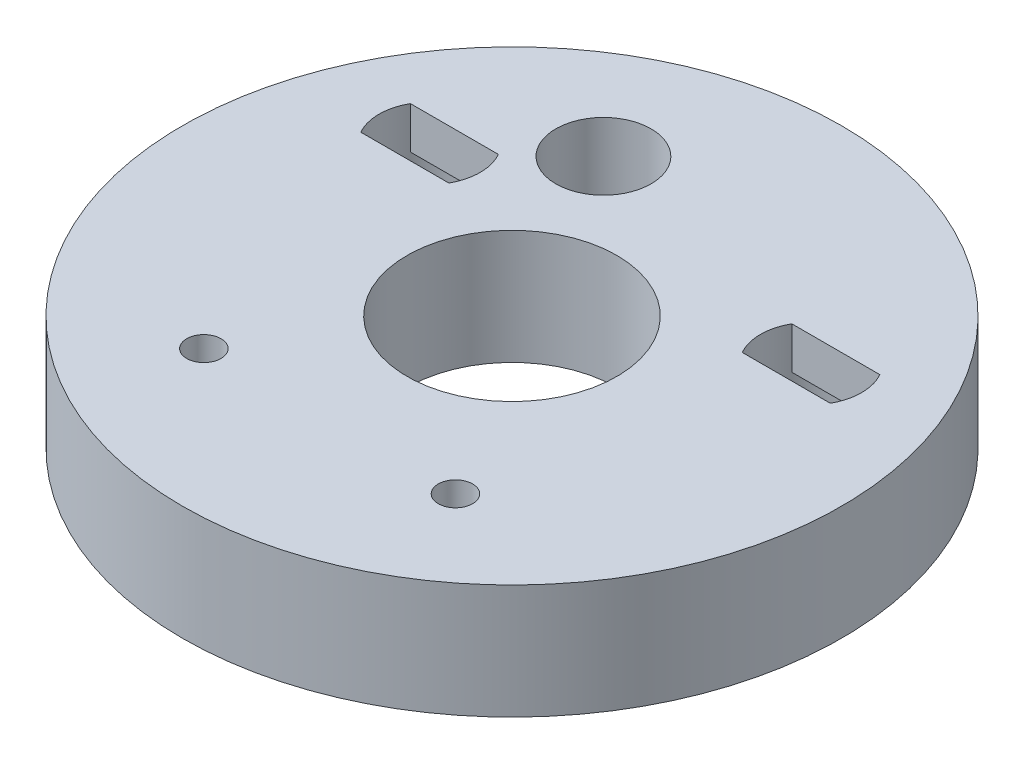
ISO-10303-21;
HEADER;
FILE_DESCRIPTION(('STEP AP214'),'2;1');
FILE_NAME('part.step','',(''),(''),'','','');
FILE_SCHEMA(('AUTOMOTIVE_DESIGN { 1 0 10303 214 1 1 1 1 }'));
ENDSEC;
DATA;
#1=APPLICATION_CONTEXT('core data for automotive mechanical design processes');
#2=APPLICATION_PROTOCOL_DEFINITION('international standard','automotive_design',2000,#1);
#3=PRODUCT_CONTEXT('',#1,'mechanical');
#4=PRODUCT('Part','Part','',(#3));
#5=PRODUCT_RELATED_PRODUCT_CATEGORY('part','',(#4));
#6=PRODUCT_DEFINITION_FORMATION('','',#4);
#7=PRODUCT_DEFINITION_CONTEXT('part definition',#1,'design');
#8=PRODUCT_DEFINITION('design','',#6,#7);
#9=PRODUCT_DEFINITION_SHAPE('','',#8);
#10=(LENGTH_UNIT() NAMED_UNIT(*) SI_UNIT(.MILLI.,.METRE.));
#11=(NAMED_UNIT(*) PLANE_ANGLE_UNIT() SI_UNIT($,.RADIAN.));
#12=(NAMED_UNIT(*) SI_UNIT($,.STERADIAN.) SOLID_ANGLE_UNIT());
#13=UNCERTAINTY_MEASURE_WITH_UNIT(LENGTH_MEASURE(1.E-05),#10,'distance_accuracy_value','');
#14=(GEOMETRIC_REPRESENTATION_CONTEXT(3) GLOBAL_UNCERTAINTY_ASSIGNED_CONTEXT((#13)) GLOBAL_UNIT_ASSIGNED_CONTEXT((#10,
#11,#12)) REPRESENTATION_CONTEXT('',''));
#15=CARTESIAN_POINT('',(0.,0.,0.));
#16=DIRECTION('',(0.,0.,1.));
#17=DIRECTION('',(1.,0.,0.));
#18=AXIS2_PLACEMENT_3D('',#15,#16,#17);
#19=CARTESIAN_POINT('',(0.,0.,0.));
#20=DIRECTION('',(0.,1.,0.));
#21=DIRECTION('',(0.,0.,1.));
#22=AXIS2_PLACEMENT_3D('',#19,#20,#21);
#23=PLANE('',#22);
#24=CARTESIAN_POINT('',(-4.85,0.,-9.64469956572096));
#25=DIRECTION('',(0.,1.,0.));
#26=DIRECTION('',(0.,0.,1.));
#27=AXIS2_PLACEMENT_3D('',#24,#25,#26);
#28=CIRCLE('',#27,2.5);
#29=CARTESIAN_POINT('',(-4.85,0.,-7.14469956572096));
#30=VERTEX_POINT('',#29);
#31=EDGE_CURVE('E201',#30,#30,#28,.T.);
#32=ORIENTED_EDGE('',*,*,#31,.T.);
#33=EDGE_LOOP('',(#32));
#34=FACE_BOUND('',#33,.T.);
#35=CARTESIAN_POINT('',(0.,0.,0.));
#36=DIRECTION('',(0.,1.,0.));
#37=DIRECTION('',(0.,0.,1.));
#38=AXIS2_PLACEMENT_3D('',#35,#36,#37);
#39=CIRCLE('',#38,17.28);
#40=CARTESIAN_POINT('',(0.,0.,-17.28));
#41=VERTEX_POINT('',#40);
#42=EDGE_CURVE('E11',#41,#41,#39,.T.);
#43=ORIENTED_EDGE('',*,*,#42,.F.);
#44=EDGE_LOOP('',(#43));
#45=FACE_BOUND('',#44,.T.);
#46=CARTESIAN_POINT('',(0.,0.,0.));
#47=DIRECTION('',(0.,1.,0.));
#48=DIRECTION('',(0.,0.,1.));
#49=AXIS2_PLACEMENT_3D('',#46,#47,#48);
#50=CIRCLE('',#49,5.5);
#51=CARTESIAN_POINT('',(0.,0.,-5.5));
#52=VERTEX_POINT('',#51);
#53=EDGE_CURVE('E47',#52,#52,#50,.T.);
#54=ORIENTED_EDGE('',*,*,#53,.T.);
#55=EDGE_LOOP('',(#54));
#56=FACE_BOUND('',#55,.T.);
#57=CARTESIAN_POINT('',(-6.595,0.,9.56109165419973));
#58=DIRECTION('',(0.,1.,0.));
#59=DIRECTION('',(0.,0.,1.));
#60=AXIS2_PLACEMENT_3D('',#57,#58,#59);
#61=CIRCLE('',#60,1.9);
#62=CARTESIAN_POINT('',(-6.595,0.,7.66109165419973));
#63=VERTEX_POINT('',#62);
#64=EDGE_CURVE('E230',#63,#63,#61,.T.);
#65=ORIENTED_EDGE('',*,*,#64,.T.);
#66=EDGE_LOOP('',(#65));
#67=FACE_BOUND('',#66,.T.);
#68=CARTESIAN_POINT('',(6.595,0.,9.56109165419973));
#69=DIRECTION('',(0.,1.,0.));
#70=DIRECTION('',(0.,0.,-1.));
#71=AXIS2_PLACEMENT_3D('',#68,#69,#70);
#72=CIRCLE('',#71,1.9);
#73=CARTESIAN_POINT('',(6.595,0.,7.66109165419973));
#74=VERTEX_POINT('',#73);
#75=EDGE_CURVE('E226',#74,#74,#72,.T.);
#76=ORIENTED_EDGE('',*,*,#75,.T.);
#77=EDGE_LOOP('',(#76));
#78=FACE_BOUND('',#77,.T.);
#79=CARTESIAN_POINT('',(10.,0.,-5.67890834580027));
#80=DIRECTION('',(0.,1.,0.));
#81=DIRECTION('',(0.,0.,-1.));
#82=AXIS2_PLACEMENT_3D('',#79,#80,#81);
#83=CIRCLE('',#82,2.65);
#84=CARTESIAN_POINT('',(10.,0.,-8.32890834580027));
#85=VERTEX_POINT('',#84);
#86=EDGE_CURVE('E219',#85,#85,#83,.T.);
#87=ORIENTED_EDGE('',*,*,#86,.T.);
#88=EDGE_LOOP('',(#87));
#89=FACE_BOUND('',#88,.T.);
#90=CARTESIAN_POINT('',(-10.,0.,-5.67890834580027));
#91=DIRECTION('',(0.,1.,0.));
#92=DIRECTION('',(0.,0.,1.));
#93=AXIS2_PLACEMENT_3D('',#90,#91,#92);
#94=CIRCLE('',#93,2.65);
#95=CARTESIAN_POINT('',(-10.,0.,-3.02890834580027));
#96=VERTEX_POINT('',#95);
#97=EDGE_CURVE('E205',#96,#96,#94,.T.);
#98=ORIENTED_EDGE('',*,*,#97,.T.);
#99=EDGE_LOOP('',(#98));
#100=FACE_BOUND('',#99,.T.);
#101=ADVANCED_FACE('F38',(#34,#45,#56,#67,#78,#89,#100),#23,.F.);
#102=CARTESIAN_POINT('',(0.,3.8,0.));
#103=DIRECTION('',(0.,-1.,0.));
#104=DIRECTION('',(0.,0.,-1.));
#105=AXIS2_PLACEMENT_3D('',#102,#103,#104);
#106=CYLINDRICAL_SURFACE('',#105,17.28);
#107=CARTESIAN_POINT('',(0.,6.,0.));
#108=DIRECTION('',(0.,1.,0.));
#109=DIRECTION('',(0.,0.,1.));
#110=AXIS2_PLACEMENT_3D('',#107,#108,#109);
#111=CIRCLE('',#110,17.28);
#112=CARTESIAN_POINT('',(0.,6.,-17.28));
#113=VERTEX_POINT('',#112);
#114=EDGE_CURVE('E196',#113,#113,#111,.T.);
#115=CARTESIAN_POINT('',(0.,0.,-17.28));
#116=CARTESIAN_POINT('',(0.,0.0625000000000001,-17.28));
#117=CARTESIAN_POINT('',(0.,0.125,-17.28));
#118=CARTESIAN_POINT('',(0.,0.25,-17.28));
#119=CARTESIAN_POINT('',(0.,0.3125,-17.28));
#120=CARTESIAN_POINT('',(0.,0.4375,-17.28));
#121=CARTESIAN_POINT('',(0.,0.5,-17.28));
#122=CARTESIAN_POINT('',(0.,0.625,-17.28));
#123=CARTESIAN_POINT('',(0.,0.6875,-17.28));
#124=CARTESIAN_POINT('',(0.,0.8125,-17.28));
#125=CARTESIAN_POINT('',(0.,0.875,-17.28));
#126=CARTESIAN_POINT('',(0.,1.,-17.28));
#127=CARTESIAN_POINT('',(0.,1.0625,-17.28));
#128=CARTESIAN_POINT('',(0.,1.1875,-17.28));
#129=CARTESIAN_POINT('',(0.,1.25,-17.28));
#130=CARTESIAN_POINT('',(0.,1.375,-17.28));
#131=CARTESIAN_POINT('',(0.,1.4375,-17.28));
#132=CARTESIAN_POINT('',(0.,1.5625,-17.28));
#133=CARTESIAN_POINT('',(0.,1.625,-17.28));
#134=CARTESIAN_POINT('',(0.,1.75,-17.28));
#135=CARTESIAN_POINT('',(0.,1.8125,-17.28));
#136=CARTESIAN_POINT('',(0.,1.9375,-17.28));
#137=CARTESIAN_POINT('',(0.,2.,-17.28));
#138=CARTESIAN_POINT('',(0.,2.125,-17.28));
#139=CARTESIAN_POINT('',(0.,2.1875,-17.28));
#140=CARTESIAN_POINT('',(0.,2.3125,-17.28));
#141=CARTESIAN_POINT('',(0.,2.375,-17.28));
#142=CARTESIAN_POINT('',(0.,2.5,-17.28));
#143=CARTESIAN_POINT('',(0.,2.5625,-17.28));
#144=CARTESIAN_POINT('',(0.,2.6875,-17.28));
#145=CARTESIAN_POINT('',(0.,2.75,-17.28));
#146=CARTESIAN_POINT('',(0.,2.875,-17.28));
#147=CARTESIAN_POINT('',(0.,2.9375,-17.28));
#148=CARTESIAN_POINT('',(0.,3.0625,-17.28));
#149=CARTESIAN_POINT('',(0.,3.125,-17.28));
#150=CARTESIAN_POINT('',(0.,3.25,-17.28));
#151=CARTESIAN_POINT('',(0.,3.3125,-17.28));
#152=CARTESIAN_POINT('',(0.,3.4375,-17.28));
#153=CARTESIAN_POINT('',(0.,3.5,-17.28));
#154=CARTESIAN_POINT('',(0.,3.625,-17.28));
#155=CARTESIAN_POINT('',(0.,3.6875,-17.28));
#156=CARTESIAN_POINT('',(0.,3.8125,-17.28));
#157=CARTESIAN_POINT('',(0.,3.875,-17.28));
#158=CARTESIAN_POINT('',(0.,4.,-17.28));
#159=CARTESIAN_POINT('',(0.,4.0625,-17.28));
#160=CARTESIAN_POINT('',(0.,4.1875,-17.28));
#161=CARTESIAN_POINT('',(0.,4.25,-17.28));
#162=CARTESIAN_POINT('',(0.,4.375,-17.28));
#163=CARTESIAN_POINT('',(0.,4.4375,-17.28));
#164=CARTESIAN_POINT('',(0.,4.5625,-17.28));
#165=CARTESIAN_POINT('',(0.,4.625,-17.28));
#166=CARTESIAN_POINT('',(0.,4.75,-17.28));
#167=CARTESIAN_POINT('',(0.,4.8125,-17.28));
#168=CARTESIAN_POINT('',(0.,4.9375,-17.28));
#169=CARTESIAN_POINT('',(0.,5.,-17.28));
#170=CARTESIAN_POINT('',(0.,5.125,-17.28));
#171=CARTESIAN_POINT('',(0.,5.1875,-17.28));
#172=CARTESIAN_POINT('',(0.,5.3125,-17.28));
#173=CARTESIAN_POINT('',(0.,5.375,-17.28));
#174=CARTESIAN_POINT('',(0.,5.5,-17.28));
#175=CARTESIAN_POINT('',(0.,5.5625,-17.28));
#176=CARTESIAN_POINT('',(0.,5.6875,-17.28));
#177=CARTESIAN_POINT('',(0.,5.75,-17.28));
#178=CARTESIAN_POINT('',(0.,5.875,-17.28));
#179=CARTESIAN_POINT('',(0.,5.9375,-17.28));
#180=CARTESIAN_POINT('',(0.,6.,-17.28));
#181=B_SPLINE_CURVE_WITH_KNOTS('',3,(#115,#116,#117,#118,#119,#120,#121,#122,#123,#124,#125,
#126,#127,#128,#129,#130,#131,#132,#133,#134,#135,#136,#137,#138,#139,#140,#141,#142,#143,#144,
#145,#146,#147,#148,#149,#150,#151,#152,#153,#154,#155,#156,#157,#158,#159,#160,#161,#162,#163,
#164,#165,#166,#167,#168,#169,#170,#171,#172,#173,#174,#175,#176,#177,#178,#179,#180),
.UNSPECIFIED.,.F.,.F.,(4,2,2,2,2,2,2,2,2,2,2,2,2,2,2,2,2,2,2,2,2,2,2,2,2,2,2,2,2,2,2,2,4),(0.,
0.1875,0.375,0.5625,0.75,0.9375,1.125,1.3125,1.5,1.6875,1.875,2.0625,2.25,2.4375,2.625,2.8125,
3.,3.1875,3.375,3.5625,3.75,3.9375,4.125,4.3125,4.5,4.6875,4.875,5.0625,5.25,5.4375,5.625,
5.8125,6.),.UNSPECIFIED.);
#182=EDGE_CURVE('BSEAM40',#41,#113,#181,.T.);
#183=ORIENTED_EDGE('',*,*,#42,.T.);
#184=ORIENTED_EDGE('',*,*,#114,.F.);
#185=ORIENTED_EDGE('',*,*,#182,.T.);
#186=ORIENTED_EDGE('',*,*,#182,.F.);
#187=EDGE_LOOP('',(#183,#185,#184,#186));
#188=FACE_BOUND('',#187,.T.);
#189=ADVANCED_FACE('F40',(#188),#106,.T.);
#190=CARTESIAN_POINT('',(0.,3.8,0.));
#191=DIRECTION('',(0.,-1.,0.));
#192=DIRECTION('',(0.,0.,-1.));
#193=AXIS2_PLACEMENT_3D('',#190,#191,#192);
#194=CYLINDRICAL_SURFACE('',#193,5.5);
#195=CARTESIAN_POINT('',(0.,6.,0.));
#196=DIRECTION('',(0.,1.,0.));
#197=DIRECTION('',(0.,0.,1.));
#198=AXIS2_PLACEMENT_3D('',#195,#196,#197);
#199=CIRCLE('',#198,5.5);
#200=CARTESIAN_POINT('',(0.,6.,-5.5));
#201=VERTEX_POINT('',#200);
#202=EDGE_CURVE('E159',#201,#201,#199,.T.);
#203=CARTESIAN_POINT('',(0.,0.,-5.5));
#204=CARTESIAN_POINT('',(0.,0.0625000000000001,-5.5));
#205=CARTESIAN_POINT('',(0.,0.125,-5.5));
#206=CARTESIAN_POINT('',(0.,0.25,-5.5));
#207=CARTESIAN_POINT('',(0.,0.3125,-5.5));
#208=CARTESIAN_POINT('',(0.,0.4375,-5.5));
#209=CARTESIAN_POINT('',(0.,0.5,-5.5));
#210=CARTESIAN_POINT('',(0.,0.625,-5.5));
#211=CARTESIAN_POINT('',(0.,0.6875,-5.5));
#212=CARTESIAN_POINT('',(0.,0.8125,-5.5));
#213=CARTESIAN_POINT('',(0.,0.875,-5.5));
#214=CARTESIAN_POINT('',(0.,1.,-5.5));
#215=CARTESIAN_POINT('',(0.,1.0625,-5.5));
#216=CARTESIAN_POINT('',(0.,1.1875,-5.5));
#217=CARTESIAN_POINT('',(0.,1.25,-5.5));
#218=CARTESIAN_POINT('',(0.,1.375,-5.5));
#219=CARTESIAN_POINT('',(0.,1.4375,-5.5));
#220=CARTESIAN_POINT('',(0.,1.5625,-5.5));
#221=CARTESIAN_POINT('',(0.,1.625,-5.5));
#222=CARTESIAN_POINT('',(0.,1.75,-5.5));
#223=CARTESIAN_POINT('',(0.,1.8125,-5.5));
#224=CARTESIAN_POINT('',(0.,1.9375,-5.5));
#225=CARTESIAN_POINT('',(0.,2.,-5.5));
#226=CARTESIAN_POINT('',(0.,2.125,-5.5));
#227=CARTESIAN_POINT('',(0.,2.1875,-5.5));
#228=CARTESIAN_POINT('',(0.,2.3125,-5.5));
#229=CARTESIAN_POINT('',(0.,2.375,-5.5));
#230=CARTESIAN_POINT('',(0.,2.5,-5.5));
#231=CARTESIAN_POINT('',(0.,2.5625,-5.5));
#232=CARTESIAN_POINT('',(0.,2.6875,-5.5));
#233=CARTESIAN_POINT('',(0.,2.75,-5.5));
#234=CARTESIAN_POINT('',(0.,2.875,-5.5));
#235=CARTESIAN_POINT('',(0.,2.9375,-5.5));
#236=CARTESIAN_POINT('',(0.,3.0625,-5.5));
#237=CARTESIAN_POINT('',(0.,3.125,-5.5));
#238=CARTESIAN_POINT('',(0.,3.25,-5.5));
#239=CARTESIAN_POINT('',(0.,3.3125,-5.5));
#240=CARTESIAN_POINT('',(0.,3.4375,-5.5));
#241=CARTESIAN_POINT('',(0.,3.5,-5.5));
#242=CARTESIAN_POINT('',(0.,3.625,-5.5));
#243=CARTESIAN_POINT('',(0.,3.6875,-5.5));
#244=CARTESIAN_POINT('',(0.,3.8125,-5.5));
#245=CARTESIAN_POINT('',(0.,3.875,-5.5));
#246=CARTESIAN_POINT('',(0.,4.,-5.5));
#247=CARTESIAN_POINT('',(0.,4.0625,-5.5));
#248=CARTESIAN_POINT('',(0.,4.1875,-5.5));
#249=CARTESIAN_POINT('',(0.,4.25,-5.5));
#250=CARTESIAN_POINT('',(0.,4.375,-5.5));
#251=CARTESIAN_POINT('',(0.,4.4375,-5.5));
#252=CARTESIAN_POINT('',(0.,4.5625,-5.5));
#253=CARTESIAN_POINT('',(0.,4.625,-5.5));
#254=CARTESIAN_POINT('',(0.,4.75,-5.5));
#255=CARTESIAN_POINT('',(0.,4.8125,-5.5));
#256=CARTESIAN_POINT('',(0.,4.9375,-5.5));
#257=CARTESIAN_POINT('',(0.,5.,-5.5));
#258=CARTESIAN_POINT('',(0.,5.125,-5.5));
#259=CARTESIAN_POINT('',(0.,5.1875,-5.5));
#260=CARTESIAN_POINT('',(0.,5.3125,-5.5));
#261=CARTESIAN_POINT('',(0.,5.375,-5.5));
#262=CARTESIAN_POINT('',(0.,5.5,-5.5));
#263=CARTESIAN_POINT('',(0.,5.5625,-5.5));
#264=CARTESIAN_POINT('',(0.,5.6875,-5.5));
#265=CARTESIAN_POINT('',(0.,5.75,-5.5));
#266=CARTESIAN_POINT('',(0.,5.875,-5.5));
#267=CARTESIAN_POINT('',(0.,5.9375,-5.5));
#268=CARTESIAN_POINT('',(0.,6.,-5.5));
#269=B_SPLINE_CURVE_WITH_KNOTS('',3,(#203,#204,#205,#206,#207,#208,#209,#210,#211,#212,#213,
#214,#215,#216,#217,#218,#219,#220,#221,#222,#223,#224,#225,#226,#227,#228,#229,#230,#231,#232,
#233,#234,#235,#236,#237,#238,#239,#240,#241,#242,#243,#244,#245,#246,#247,#248,#249,#250,#251,
#252,#253,#254,#255,#256,#257,#258,#259,#260,#261,#262,#263,#264,#265,#266,#267,#268),
.UNSPECIFIED.,.F.,.F.,(4,2,2,2,2,2,2,2,2,2,2,2,2,2,2,2,2,2,2,2,2,2,2,2,2,2,2,2,2,2,2,2,4),(0.,
0.1875,0.375,0.5625,0.75,0.9375,1.125,1.3125,1.5,1.6875,1.875,2.0625,2.25,2.4375,2.625,2.8125,
3.,3.1875,3.375,3.5625,3.75,3.9375,4.125,4.3125,4.5,4.6875,4.875,5.0625,5.25,5.4375,5.625,
5.8125,6.),.UNSPECIFIED.);
#270=EDGE_CURVE('BSEAM243',#52,#201,#269,.T.);
#271=ORIENTED_EDGE('',*,*,#53,.F.);
#272=ORIENTED_EDGE('',*,*,#202,.T.);
#273=ORIENTED_EDGE('',*,*,#270,.T.);
#274=ORIENTED_EDGE('',*,*,#270,.F.);
#275=EDGE_LOOP('',(#271,#273,#272,#274));
#276=FACE_BOUND('',#275,.T.);
#277=ADVANCED_FACE('F243',(#276),#194,.F.);
#278=CARTESIAN_POINT('',(-6.595,3.8,9.56109165419973));
#279=DIRECTION('',(0.,-1.,0.));
#280=DIRECTION('',(0.,0.,-1.));
#281=AXIS2_PLACEMENT_3D('',#278,#279,#280);
#282=CYLINDRICAL_SURFACE('',#281,1.9);
#283=CARTESIAN_POINT('',(-6.595,3.8,9.56109165419973));
#284=DIRECTION('',(0.,1.,0.));
#285=DIRECTION('',(0.,0.,1.));
#286=AXIS2_PLACEMENT_3D('',#283,#284,#285);
#287=CIRCLE('',#286,1.9);
#288=CARTESIAN_POINT('',(-6.595,3.8,7.66109165419973));
#289=VERTEX_POINT('',#288);
#290=EDGE_CURVE('E206',#289,#289,#287,.T.);
#291=CARTESIAN_POINT('',(-6.595,3.8,7.66109165419973));
#292=CARTESIAN_POINT('',(-6.595,3.76041666666667,7.66109165419973));
#293=CARTESIAN_POINT('',(-6.595,3.72083333333333,7.66109165419973));
#294=CARTESIAN_POINT('',(-6.595,3.64166666666667,7.66109165419973));
#295=CARTESIAN_POINT('',(-6.595,3.60208333333333,7.66109165419973));
#296=CARTESIAN_POINT('',(-6.595,3.52291666666667,7.66109165419973));
#297=CARTESIAN_POINT('',(-6.595,3.48333333333333,7.66109165419973));
#298=CARTESIAN_POINT('',(-6.595,3.40416666666667,7.66109165419973));
#299=CARTESIAN_POINT('',(-6.595,3.36458333333333,7.66109165419973));
#300=CARTESIAN_POINT('',(-6.595,3.28541666666667,7.66109165419973));
#301=CARTESIAN_POINT('',(-6.595,3.24583333333333,7.66109165419973));
#302=CARTESIAN_POINT('',(-6.595,3.16666666666667,7.66109165419973));
#303=CARTESIAN_POINT('',(-6.595,3.12708333333333,7.66109165419973));
#304=CARTESIAN_POINT('',(-6.595,3.04791666666667,7.66109165419973));
#305=CARTESIAN_POINT('',(-6.595,3.00833333333333,7.66109165419973));
#306=CARTESIAN_POINT('',(-6.595,2.92916666666667,7.66109165419973));
#307=CARTESIAN_POINT('',(-6.595,2.88958333333333,7.66109165419973));
#308=CARTESIAN_POINT('',(-6.595,2.81041666666667,7.66109165419973));
#309=CARTESIAN_POINT('',(-6.595,2.77083333333333,7.66109165419973));
#310=CARTESIAN_POINT('',(-6.595,2.69166666666667,7.66109165419973));
#311=CARTESIAN_POINT('',(-6.595,2.65208333333333,7.66109165419973));
#312=CARTESIAN_POINT('',(-6.595,2.57291666666667,7.66109165419973));
#313=CARTESIAN_POINT('',(-6.595,2.53333333333333,7.66109165419973));
#314=CARTESIAN_POINT('',(-6.595,2.45416666666667,7.66109165419973));
#315=CARTESIAN_POINT('',(-6.595,2.41458333333333,7.66109165419973));
#316=CARTESIAN_POINT('',(-6.595,2.33541666666667,7.66109165419973));
#317=CARTESIAN_POINT('',(-6.595,2.29583333333333,7.66109165419973));
#318=CARTESIAN_POINT('',(-6.595,2.21666666666667,7.66109165419973));
#319=CARTESIAN_POINT('',(-6.595,2.17708333333333,7.66109165419973));
#320=CARTESIAN_POINT('',(-6.595,2.09791666666667,7.66109165419973));
#321=CARTESIAN_POINT('',(-6.595,2.05833333333333,7.66109165419973));
#322=CARTESIAN_POINT('',(-6.595,1.97916666666667,7.66109165419973));
#323=CARTESIAN_POINT('',(-6.595,1.93958333333333,7.66109165419973));
#324=CARTESIAN_POINT('',(-6.595,1.86041666666667,7.66109165419973));
#325=CARTESIAN_POINT('',(-6.595,1.82083333333333,7.66109165419973));
#326=CARTESIAN_POINT('',(-6.595,1.74166666666667,7.66109165419973));
#327=CARTESIAN_POINT('',(-6.595,1.70208333333333,7.66109165419973));
#328=CARTESIAN_POINT('',(-6.595,1.62291666666667,7.66109165419973));
#329=CARTESIAN_POINT('',(-6.595,1.58333333333333,7.66109165419973));
#330=CARTESIAN_POINT('',(-6.595,1.50416666666667,7.66109165419973));
#331=CARTESIAN_POINT('',(-6.595,1.46458333333333,7.66109165419973));
#332=CARTESIAN_POINT('',(-6.595,1.38541666666667,7.66109165419973));
#333=CARTESIAN_POINT('',(-6.595,1.34583333333333,7.66109165419973));
#334=CARTESIAN_POINT('',(-6.595,1.26666666666667,7.66109165419973));
#335=CARTESIAN_POINT('',(-6.595,1.22708333333333,7.66109165419973));
#336=CARTESIAN_POINT('',(-6.595,1.14791666666667,7.66109165419973));
#337=CARTESIAN_POINT('',(-6.595,1.10833333333333,7.66109165419973));
#338=CARTESIAN_POINT('',(-6.595,1.02916666666667,7.66109165419973));
#339=CARTESIAN_POINT('',(-6.595,0.989583333333334,7.66109165419973));
#340=CARTESIAN_POINT('',(-6.595,0.910416666666667,7.66109165419973));
#341=CARTESIAN_POINT('',(-6.595,0.870833333333333,7.66109165419973));
#342=CARTESIAN_POINT('',(-6.595,0.791666666666667,7.66109165419973));
#343=CARTESIAN_POINT('',(-6.595,0.752083333333333,7.66109165419973));
#344=CARTESIAN_POINT('',(-6.595,0.672916666666667,7.66109165419973));
#345=CARTESIAN_POINT('',(-6.595,0.633333333333333,7.66109165419973));
#346=CARTESIAN_POINT('',(-6.595,0.554166666666667,7.66109165419973));
#347=CARTESIAN_POINT('',(-6.595,0.514583333333334,7.66109165419973));
#348=CARTESIAN_POINT('',(-6.595,0.435416666666667,7.66109165419973));
#349=CARTESIAN_POINT('',(-6.595,0.395833333333334,7.66109165419973));
#350=CARTESIAN_POINT('',(-6.595,0.316666666666667,7.66109165419973));
#351=CARTESIAN_POINT('',(-6.595,0.277083333333333,7.66109165419973));
#352=CARTESIAN_POINT('',(-6.595,0.197916666666667,7.66109165419973));
#353=CARTESIAN_POINT('',(-6.595,0.158333333333333,7.66109165419973));
#354=CARTESIAN_POINT('',(-6.595,0.0791666666666666,7.66109165419973));
#355=CARTESIAN_POINT('',(-6.595,0.0395833333333333,7.66109165419973));
#356=CARTESIAN_POINT('',(-6.595,0.,7.66109165419973));
#357=B_SPLINE_CURVE_WITH_KNOTS('',3,(#291,#292,#293,#294,#295,#296,#297,#298,#299,#300,#301,
#302,#303,#304,#305,#306,#307,#308,#309,#310,#311,#312,#313,#314,#315,#316,#317,#318,#319,#320,
#321,#322,#323,#324,#325,#326,#327,#328,#329,#330,#331,#332,#333,#334,#335,#336,#337,#338,#339,
#340,#341,#342,#343,#344,#345,#346,#347,#348,#349,#350,#351,#352,#353,#354,#355,#356),
.UNSPECIFIED.,.F.,.F.,(4,2,2,2,2,2,2,2,2,2,2,2,2,2,2,2,2,2,2,2,2,2,2,2,2,2,2,2,2,2,2,2,4),(0.,
0.11875,0.2375,0.35625,0.475,0.59375,0.7125,0.83125,0.95,1.06875,1.1875,1.30625,1.425,1.54375,
1.6625,1.78125,1.9,2.01875,2.1375,2.25625,2.375,2.49375,2.6125,2.73125,2.85,2.96875,3.0875,
3.20625,3.325,3.44375,3.5625,3.68125,3.8),.UNSPECIFIED.);
#358=EDGE_CURVE('BSEAM246',#289,#63,#357,.T.);
#359=ORIENTED_EDGE('',*,*,#290,.T.);
#360=ORIENTED_EDGE('',*,*,#64,.F.);
#361=ORIENTED_EDGE('',*,*,#358,.T.);
#362=ORIENTED_EDGE('',*,*,#358,.F.);
#363=EDGE_LOOP('',(#359,#361,#360,#362));
#364=FACE_BOUND('',#363,.T.);
#365=ADVANCED_FACE('F246',(#364),#282,.F.);
#366=CARTESIAN_POINT('',(6.595,3.8,9.56109165419973));
#367=DIRECTION('',(0.,-1.,0.));
#368=DIRECTION('',(0.,0.,-1.));
#369=AXIS2_PLACEMENT_3D('',#366,#367,#368);
#370=CYLINDRICAL_SURFACE('',#369,1.9);
#371=CARTESIAN_POINT('',(6.595,3.8,9.56109165419973));
#372=DIRECTION('',(0.,1.,0.));
#373=DIRECTION('',(0.,0.,-1.));
#374=AXIS2_PLACEMENT_3D('',#371,#372,#373);
#375=CIRCLE('',#374,1.9);
#376=CARTESIAN_POINT('',(6.595,3.8,7.66109165419973));
#377=VERTEX_POINT('',#376);
#378=EDGE_CURVE('E200',#377,#377,#375,.T.);
#379=CARTESIAN_POINT('',(6.595,3.8,7.66109165419973));
#380=CARTESIAN_POINT('',(6.595,3.76041666666667,7.66109165419973));
#381=CARTESIAN_POINT('',(6.595,3.72083333333333,7.66109165419973));
#382=CARTESIAN_POINT('',(6.595,3.64166666666667,7.66109165419973));
#383=CARTESIAN_POINT('',(6.595,3.60208333333333,7.66109165419973));
#384=CARTESIAN_POINT('',(6.595,3.52291666666667,7.66109165419973));
#385=CARTESIAN_POINT('',(6.595,3.48333333333333,7.66109165419973));
#386=CARTESIAN_POINT('',(6.595,3.40416666666667,7.66109165419973));
#387=CARTESIAN_POINT('',(6.595,3.36458333333333,7.66109165419973));
#388=CARTESIAN_POINT('',(6.595,3.28541666666667,7.66109165419973));
#389=CARTESIAN_POINT('',(6.595,3.24583333333333,7.66109165419973));
#390=CARTESIAN_POINT('',(6.595,3.16666666666667,7.66109165419973));
#391=CARTESIAN_POINT('',(6.595,3.12708333333333,7.66109165419973));
#392=CARTESIAN_POINT('',(6.595,3.04791666666667,7.66109165419973));
#393=CARTESIAN_POINT('',(6.595,3.00833333333333,7.66109165419973));
#394=CARTESIAN_POINT('',(6.595,2.92916666666667,7.66109165419973));
#395=CARTESIAN_POINT('',(6.595,2.88958333333333,7.66109165419973));
#396=CARTESIAN_POINT('',(6.595,2.81041666666667,7.66109165419973));
#397=CARTESIAN_POINT('',(6.595,2.77083333333333,7.66109165419973));
#398=CARTESIAN_POINT('',(6.595,2.69166666666667,7.66109165419973));
#399=CARTESIAN_POINT('',(6.595,2.65208333333333,7.66109165419973));
#400=CARTESIAN_POINT('',(6.595,2.57291666666667,7.66109165419973));
#401=CARTESIAN_POINT('',(6.595,2.53333333333333,7.66109165419973));
#402=CARTESIAN_POINT('',(6.595,2.45416666666667,7.66109165419973));
#403=CARTESIAN_POINT('',(6.595,2.41458333333333,7.66109165419973));
#404=CARTESIAN_POINT('',(6.595,2.33541666666667,7.66109165419973));
#405=CARTESIAN_POINT('',(6.595,2.29583333333333,7.66109165419973));
#406=CARTESIAN_POINT('',(6.595,2.21666666666667,7.66109165419973));
#407=CARTESIAN_POINT('',(6.595,2.17708333333333,7.66109165419973));
#408=CARTESIAN_POINT('',(6.595,2.09791666666667,7.66109165419973));
#409=CARTESIAN_POINT('',(6.595,2.05833333333333,7.66109165419973));
#410=CARTESIAN_POINT('',(6.595,1.97916666666667,7.66109165419973));
#411=CARTESIAN_POINT('',(6.595,1.93958333333333,7.66109165419973));
#412=CARTESIAN_POINT('',(6.595,1.86041666666667,7.66109165419973));
#413=CARTESIAN_POINT('',(6.595,1.82083333333333,7.66109165419973));
#414=CARTESIAN_POINT('',(6.595,1.74166666666667,7.66109165419973));
#415=CARTESIAN_POINT('',(6.595,1.70208333333333,7.66109165419973));
#416=CARTESIAN_POINT('',(6.595,1.62291666666667,7.66109165419973));
#417=CARTESIAN_POINT('',(6.595,1.58333333333333,7.66109165419973));
#418=CARTESIAN_POINT('',(6.595,1.50416666666667,7.66109165419973));
#419=CARTESIAN_POINT('',(6.595,1.46458333333333,7.66109165419973));
#420=CARTESIAN_POINT('',(6.595,1.38541666666667,7.66109165419973));
#421=CARTESIAN_POINT('',(6.595,1.34583333333333,7.66109165419973));
#422=CARTESIAN_POINT('',(6.595,1.26666666666667,7.66109165419973));
#423=CARTESIAN_POINT('',(6.595,1.22708333333333,7.66109165419973));
#424=CARTESIAN_POINT('',(6.595,1.14791666666667,7.66109165419973));
#425=CARTESIAN_POINT('',(6.595,1.10833333333333,7.66109165419973));
#426=CARTESIAN_POINT('',(6.595,1.02916666666667,7.66109165419973));
#427=CARTESIAN_POINT('',(6.595,0.989583333333334,7.66109165419973));
#428=CARTESIAN_POINT('',(6.595,0.910416666666667,7.66109165419973));
#429=CARTESIAN_POINT('',(6.595,0.870833333333333,7.66109165419973));
#430=CARTESIAN_POINT('',(6.595,0.791666666666667,7.66109165419973));
#431=CARTESIAN_POINT('',(6.595,0.752083333333333,7.66109165419973));
#432=CARTESIAN_POINT('',(6.595,0.672916666666667,7.66109165419973));
#433=CARTESIAN_POINT('',(6.595,0.633333333333333,7.66109165419973));
#434=CARTESIAN_POINT('',(6.595,0.554166666666667,7.66109165419973));
#435=CARTESIAN_POINT('',(6.595,0.514583333333334,7.66109165419973));
#436=CARTESIAN_POINT('',(6.595,0.435416666666667,7.66109165419973));
#437=CARTESIAN_POINT('',(6.595,0.395833333333334,7.66109165419973));
#438=CARTESIAN_POINT('',(6.595,0.316666666666667,7.66109165419973));
#439=CARTESIAN_POINT('',(6.595,0.277083333333333,7.66109165419973));
#440=CARTESIAN_POINT('',(6.595,0.197916666666667,7.66109165419973));
#441=CARTESIAN_POINT('',(6.595,0.158333333333333,7.66109165419973));
#442=CARTESIAN_POINT('',(6.595,0.0791666666666666,7.66109165419973));
#443=CARTESIAN_POINT('',(6.595,0.0395833333333333,7.66109165419973));
#444=CARTESIAN_POINT('',(6.595,0.,7.66109165419973));
#445=B_SPLINE_CURVE_WITH_KNOTS('',3,(#379,#380,#381,#382,#383,#384,#385,#386,#387,#388,#389,
#390,#391,#392,#393,#394,#395,#396,#397,#398,#399,#400,#401,#402,#403,#404,#405,#406,#407,#408,
#409,#410,#411,#412,#413,#414,#415,#416,#417,#418,#419,#420,#421,#422,#423,#424,#425,#426,#427,
#428,#429,#430,#431,#432,#433,#434,#435,#436,#437,#438,#439,#440,#441,#442,#443,#444),
.UNSPECIFIED.,.F.,.F.,(4,2,2,2,2,2,2,2,2,2,2,2,2,2,2,2,2,2,2,2,2,2,2,2,2,2,2,2,2,2,2,2,4),(0.,
0.11875,0.2375,0.35625,0.475,0.59375,0.7125,0.83125,0.95,1.06875,1.1875,1.30625,1.425,1.54375,
1.6625,1.78125,1.9,2.01875,2.1375,2.25625,2.375,2.49375,2.6125,2.73125,2.85,2.96875,3.0875,
3.20625,3.325,3.44375,3.5625,3.68125,3.8),.UNSPECIFIED.);
#446=EDGE_CURVE('BSEAM289',#377,#74,#445,.T.);
#447=ORIENTED_EDGE('',*,*,#378,.T.);
#448=ORIENTED_EDGE('',*,*,#75,.F.);
#449=ORIENTED_EDGE('',*,*,#446,.T.);
#450=ORIENTED_EDGE('',*,*,#446,.F.);
#451=EDGE_LOOP('',(#447,#449,#448,#450));
#452=FACE_BOUND('',#451,.T.);
#453=ADVANCED_FACE('F289',(#452),#370,.F.);
#454=CARTESIAN_POINT('',(10.,3.8,-5.67890834580027));
#455=DIRECTION('',(0.,-1.,0.));
#456=DIRECTION('',(0.,0.,-1.));
#457=AXIS2_PLACEMENT_3D('',#454,#455,#456);
#458=CYLINDRICAL_SURFACE('',#457,2.65);
#459=CARTESIAN_POINT('',(10.,3.8,-5.67890834580027));
#460=DIRECTION('',(0.,1.,0.));
#461=DIRECTION('',(0.,0.,-1.));
#462=AXIS2_PLACEMENT_3D('',#459,#460,#461);
#463=CIRCLE('',#462,2.65);
#464=CARTESIAN_POINT('',(12.3092206477511,3.8,-6.97890834580027));
#465=VERTEX_POINT('',#464);
#466=CARTESIAN_POINT('',(7.6907793522489,3.8,-6.97890834580027));
#467=VERTEX_POINT('',#466);
#468=EDGE_CURVE('E214',#465,#467,#463,.T.);
#469=ORIENTED_EDGE('',*,*,#468,.T.);
#470=DIRECTION('',(0.,-1.,0.));
#471=VECTOR('',#470,1.);
#472=CARTESIAN_POINT('',(7.6907793522489,6.,-6.97890834580027));
#473=LINE('',#472,#471);
#474=CARTESIAN_POINT('',(7.6907793522489,6.,-6.97890834580027));
#475=VERTEX_POINT('',#474);
#476=EDGE_CURVE('E177',#475,#467,#473,.T.);
#477=ORIENTED_EDGE('',*,*,#476,.F.);
#478=CARTESIAN_POINT('',(10.,6.,-5.67890834580027));
#479=DIRECTION('',(0.,1.,0.));
#480=DIRECTION('',(0.,0.,-1.));
#481=AXIS2_PLACEMENT_3D('',#478,#479,#480);
#482=CIRCLE('',#481,2.65);
#483=CARTESIAN_POINT('',(7.6907793522489,6.,-4.37890834580027));
#484=VERTEX_POINT('',#483);
#485=EDGE_CURVE('E164',#475,#484,#482,.T.);
#486=ORIENTED_EDGE('',*,*,#485,.T.);
#487=DIRECTION('',(0.,-1.,0.));
#488=VECTOR('',#487,1.);
#489=CARTESIAN_POINT('',(7.6907793522489,6.,-4.37890834580027));
#490=LINE('',#489,#488);
#491=CARTESIAN_POINT('',(7.6907793522489,3.8,-4.37890834580027));
#492=VERTEX_POINT('',#491);
#493=EDGE_CURVE('E192',#484,#492,#490,.T.);
#494=ORIENTED_EDGE('',*,*,#493,.T.);
#495=CARTESIAN_POINT('',(12.3092206477511,3.8,-4.37890834580027));
#496=VERTEX_POINT('',#495);
#497=EDGE_CURVE('E218',#492,#496,#463,.T.);
#498=ORIENTED_EDGE('',*,*,#497,.T.);
#499=DIRECTION('',(0.,-1.,0.));
#500=VECTOR('',#499,1.);
#501=CARTESIAN_POINT('',(12.3092206477511,6.,-4.37890834580027));
#502=LINE('',#501,#500);
#503=CARTESIAN_POINT('',(12.3092206477511,6.,-4.37890834580027));
#504=VERTEX_POINT('',#503);
#505=EDGE_CURVE('E189',#504,#496,#502,.T.);
#506=ORIENTED_EDGE('',*,*,#505,.F.);
#507=CARTESIAN_POINT('',(10.,6.,-5.67890834580027));
#508=DIRECTION('',(0.,1.,0.));
#509=DIRECTION('',(0.,0.,-1.));
#510=AXIS2_PLACEMENT_3D('',#507,#508,#509);
#511=CIRCLE('',#510,2.65);
#512=CARTESIAN_POINT('',(12.3092206477511,6.,-6.97890834580027));
#513=VERTEX_POINT('',#512);
#514=EDGE_CURVE('E170',#504,#513,#511,.T.);
#515=ORIENTED_EDGE('',*,*,#514,.T.);
#516=DIRECTION('',(0.,-1.,0.));
#517=VECTOR('',#516,1.);
#518=CARTESIAN_POINT('',(12.3092206477511,6.,-6.97890834580027));
#519=LINE('',#518,#517);
#520=EDGE_CURVE('E185',#513,#465,#519,.T.);
#521=ORIENTED_EDGE('',*,*,#520,.T.);
#522=EDGE_LOOP('',(#469,#477,#486,#494,#498,#506,#515,#521));
#523=FACE_BOUND('',#522,.T.);
#524=ORIENTED_EDGE('',*,*,#86,.F.);
#525=EDGE_LOOP('',(#524));
#526=FACE_BOUND('',#525,.T.);
#527=ADVANCED_FACE('F276',(#523,#526),#458,.F.);
#528=CARTESIAN_POINT('',(-10.,3.8,-5.67890834580027));
#529=DIRECTION('',(0.,-1.,0.));
#530=DIRECTION('',(0.,0.,-1.));
#531=AXIS2_PLACEMENT_3D('',#528,#529,#530);
#532=CYLINDRICAL_SURFACE('',#531,2.65);
#533=CARTESIAN_POINT('',(-10.,3.8,-5.67890834580027));
#534=DIRECTION('',(0.,1.,0.));
#535=DIRECTION('',(0.,0.,1.));
#536=AXIS2_PLACEMENT_3D('',#533,#534,#535);
#537=CIRCLE('',#536,2.65);
#538=CARTESIAN_POINT('',(-12.3092206477511,3.8,-4.37890834580027));
#539=VERTEX_POINT('',#538);
#540=CARTESIAN_POINT('',(-7.6907793522489,3.8,-4.37890834580027));
#541=VERTEX_POINT('',#540);
#542=EDGE_CURVE('E207',#539,#541,#537,.T.);
#543=ORIENTED_EDGE('',*,*,#542,.T.);
#544=DIRECTION('',(0.,-1.,0.));
#545=VECTOR('',#544,1.);
#546=CARTESIAN_POINT('',(-7.6907793522489,6.,-4.37890834580027));
#547=LINE('',#546,#545);
#548=CARTESIAN_POINT('',(-7.6907793522489,6.,-4.37890834580027));
#549=VERTEX_POINT('',#548);
#550=EDGE_CURVE('E125',#549,#541,#547,.T.);
#551=ORIENTED_EDGE('',*,*,#550,.F.);
#552=CARTESIAN_POINT('',(-10.,6.,-5.67890834580027));
#553=DIRECTION('',(0.,1.,0.));
#554=DIRECTION('',(0.,0.,1.));
#555=AXIS2_PLACEMENT_3D('',#552,#553,#554);
#556=CIRCLE('',#555,2.65);
#557=CARTESIAN_POINT('',(-7.6907793522489,6.,-6.97890834580027));
#558=VERTEX_POINT('',#557);
#559=EDGE_CURVE('E131',#549,#558,#556,.T.);
#560=ORIENTED_EDGE('',*,*,#559,.T.);
#561=DIRECTION('',(0.,-1.,0.));
#562=VECTOR('',#561,1.);
#563=CARTESIAN_POINT('',(-7.6907793522489,6.,-6.97890834580027));
#564=LINE('',#563,#562);
#565=CARTESIAN_POINT('',(-7.6907793522489,3.8,-6.97890834580027));
#566=VERTEX_POINT('',#565);
#567=EDGE_CURVE('E150',#558,#566,#564,.T.);
#568=ORIENTED_EDGE('',*,*,#567,.T.);
#569=CARTESIAN_POINT('',(-12.3092206477511,3.8,-6.97890834580027));
#570=VERTEX_POINT('',#569);
#571=EDGE_CURVE('E210',#566,#570,#537,.T.);
#572=ORIENTED_EDGE('',*,*,#571,.T.);
#573=DIRECTION('',(0.,-1.,0.));
#574=VECTOR('',#573,1.);
#575=CARTESIAN_POINT('',(-12.3092206477511,6.,-6.97890834580027));
#576=LINE('',#575,#574);
#577=CARTESIAN_POINT('',(-12.3092206477511,6.,-6.97890834580027));
#578=VERTEX_POINT('',#577);
#579=EDGE_CURVE('E112',#578,#570,#576,.T.);
#580=ORIENTED_EDGE('',*,*,#579,.F.);
#581=CARTESIAN_POINT('',(-10.,6.,-5.67890834580027));
#582=DIRECTION('',(0.,1.,0.));
#583=DIRECTION('',(0.,0.,1.));
#584=AXIS2_PLACEMENT_3D('',#581,#582,#583);
#585=CIRCLE('',#584,2.65);
#586=CARTESIAN_POINT('',(-12.3092206477511,6.,-4.37890834580027));
#587=VERTEX_POINT('',#586);
#588=EDGE_CURVE('E105',#578,#587,#585,.T.);
#589=ORIENTED_EDGE('',*,*,#588,.T.);
#590=DIRECTION('',(0.,-1.,0.));
#591=VECTOR('',#590,1.);
#592=CARTESIAN_POINT('',(-12.3092206477511,6.,-4.37890834580027));
#593=LINE('',#592,#591);
#594=EDGE_CURVE('E110',#587,#539,#593,.T.);
#595=ORIENTED_EDGE('',*,*,#594,.T.);
#596=EDGE_LOOP('',(#543,#551,#560,#568,#572,#580,#589,#595));
#597=FACE_BOUND('',#596,.T.);
#598=ORIENTED_EDGE('',*,*,#97,.F.);
#599=EDGE_LOOP('',(#598));
#600=FACE_BOUND('',#599,.T.);
#601=ADVANCED_FACE('F108',(#597,#600),#532,.F.);
#602=CARTESIAN_POINT('',(-4.85,0.,-9.64469956572096));
#603=DIRECTION('',(0.,1.,0.));
#604=DIRECTION('',(0.,0.,1.));
#605=AXIS2_PLACEMENT_3D('',#602,#603,#604);
#606=CYLINDRICAL_SURFACE('',#605,2.5);
#607=CARTESIAN_POINT('',(-4.85,6.,-9.64469956572096));
#608=DIRECTION('',(0.,1.,0.));
#609=DIRECTION('',(0.,0.,1.));
#610=AXIS2_PLACEMENT_3D('',#607,#608,#609);
#611=CIRCLE('',#610,2.5);
#612=CARTESIAN_POINT('',(-4.85,6.,-7.14469956572096));
#613=VERTEX_POINT('',#612);
#614=EDGE_CURVE('E124',#613,#613,#611,.T.);
#615=CARTESIAN_POINT('',(-4.85,0.,-7.14469956572096));
#616=CARTESIAN_POINT('',(-4.85,0.0624999999999999,-7.14469956572096));
#617=CARTESIAN_POINT('',(-4.85,0.125,-7.14469956572096));
#618=CARTESIAN_POINT('',(-4.85,0.25,-7.14469956572096));
#619=CARTESIAN_POINT('',(-4.85,0.3125,-7.14469956572096));
#620=CARTESIAN_POINT('',(-4.85,0.4375,-7.14469956572096));
#621=CARTESIAN_POINT('',(-4.85,0.5,-7.14469956572096));
#622=CARTESIAN_POINT('',(-4.85,0.625,-7.14469956572096));
#623=CARTESIAN_POINT('',(-4.85,0.6875,-7.14469956572096));
#624=CARTESIAN_POINT('',(-4.85,0.8125,-7.14469956572096));
#625=CARTESIAN_POINT('',(-4.85,0.875,-7.14469956572096));
#626=CARTESIAN_POINT('',(-4.85,1.,-7.14469956572096));
#627=CARTESIAN_POINT('',(-4.85,1.0625,-7.14469956572096));
#628=CARTESIAN_POINT('',(-4.85,1.1875,-7.14469956572096));
#629=CARTESIAN_POINT('',(-4.85,1.25,-7.14469956572096));
#630=CARTESIAN_POINT('',(-4.85,1.375,-7.14469956572096));
#631=CARTESIAN_POINT('',(-4.85,1.4375,-7.14469956572096));
#632=CARTESIAN_POINT('',(-4.85,1.5625,-7.14469956572096));
#633=CARTESIAN_POINT('',(-4.85,1.625,-7.14469956572096));
#634=CARTESIAN_POINT('',(-4.85,1.75,-7.14469956572096));
#635=CARTESIAN_POINT('',(-4.85,1.8125,-7.14469956572096));
#636=CARTESIAN_POINT('',(-4.85,1.9375,-7.14469956572096));
#637=CARTESIAN_POINT('',(-4.85,2.,-7.14469956572096));
#638=CARTESIAN_POINT('',(-4.85,2.125,-7.14469956572096));
#639=CARTESIAN_POINT('',(-4.85,2.1875,-7.14469956572096));
#640=CARTESIAN_POINT('',(-4.85,2.3125,-7.14469956572096));
#641=CARTESIAN_POINT('',(-4.85,2.375,-7.14469956572096));
#642=CARTESIAN_POINT('',(-4.85,2.5,-7.14469956572096));
#643=CARTESIAN_POINT('',(-4.85,2.5625,-7.14469956572096));
#644=CARTESIAN_POINT('',(-4.85,2.6875,-7.14469956572096));
#645=CARTESIAN_POINT('',(-4.85,2.75,-7.14469956572096));
#646=CARTESIAN_POINT('',(-4.85,2.875,-7.14469956572096));
#647=CARTESIAN_POINT('',(-4.85,2.9375,-7.14469956572096));
#648=CARTESIAN_POINT('',(-4.85,3.0625,-7.14469956572096));
#649=CARTESIAN_POINT('',(-4.85,3.125,-7.14469956572096));
#650=CARTESIAN_POINT('',(-4.85,3.25,-7.14469956572096));
#651=CARTESIAN_POINT('',(-4.85,3.3125,-7.14469956572096));
#652=CARTESIAN_POINT('',(-4.85,3.4375,-7.14469956572096));
#653=CARTESIAN_POINT('',(-4.85,3.5,-7.14469956572096));
#654=CARTESIAN_POINT('',(-4.85,3.625,-7.14469956572096));
#655=CARTESIAN_POINT('',(-4.85,3.6875,-7.14469956572096));
#656=CARTESIAN_POINT('',(-4.85,3.8125,-7.14469956572096));
#657=CARTESIAN_POINT('',(-4.85,3.875,-7.14469956572096));
#658=CARTESIAN_POINT('',(-4.85,4.,-7.14469956572096));
#659=CARTESIAN_POINT('',(-4.85,4.0625,-7.14469956572096));
#660=CARTESIAN_POINT('',(-4.85,4.1875,-7.14469956572096));
#661=CARTESIAN_POINT('',(-4.85,4.25,-7.14469956572096));
#662=CARTESIAN_POINT('',(-4.85,4.375,-7.14469956572096));
#663=CARTESIAN_POINT('',(-4.85,4.4375,-7.14469956572096));
#664=CARTESIAN_POINT('',(-4.85,4.5625,-7.14469956572096));
#665=CARTESIAN_POINT('',(-4.85,4.625,-7.14469956572096));
#666=CARTESIAN_POINT('',(-4.85,4.75,-7.14469956572096));
#667=CARTESIAN_POINT('',(-4.85,4.8125,-7.14469956572096));
#668=CARTESIAN_POINT('',(-4.85,4.9375,-7.14469956572096));
#669=CARTESIAN_POINT('',(-4.85,5.,-7.14469956572096));
#670=CARTESIAN_POINT('',(-4.85,5.125,-7.14469956572096));
#671=CARTESIAN_POINT('',(-4.85,5.1875,-7.14469956572096));
#672=CARTESIAN_POINT('',(-4.85,5.3125,-7.14469956572096));
#673=CARTESIAN_POINT('',(-4.85,5.375,-7.14469956572096));
#674=CARTESIAN_POINT('',(-4.85,5.5,-7.14469956572096));
#675=CARTESIAN_POINT('',(-4.85,5.5625,-7.14469956572096));
#676=CARTESIAN_POINT('',(-4.85,5.6875,-7.14469956572096));
#677=CARTESIAN_POINT('',(-4.85,5.75,-7.14469956572096));
#678=CARTESIAN_POINT('',(-4.85,5.875,-7.14469956572096));
#679=CARTESIAN_POINT('',(-4.85,5.9375,-7.14469956572096));
#680=CARTESIAN_POINT('',(-4.85,6.,-7.14469956572096));
#681=B_SPLINE_CURVE_WITH_KNOTS('',3,(#615,#616,#617,#618,#619,#620,#621,#622,#623,#624,#625,
#626,#627,#628,#629,#630,#631,#632,#633,#634,#635,#636,#637,#638,#639,#640,#641,#642,#643,#644,
#645,#646,#647,#648,#649,#650,#651,#652,#653,#654,#655,#656,#657,#658,#659,#660,#661,#662,#663,
#664,#665,#666,#667,#668,#669,#670,#671,#672,#673,#674,#675,#676,#677,#678,#679,#680),
.UNSPECIFIED.,.F.,.F.,(4,2,2,2,2,2,2,2,2,2,2,2,2,2,2,2,2,2,2,2,2,2,2,2,2,2,2,2,2,2,2,2,4),(0.,
0.1875,0.375,0.5625,0.75,0.9375,1.125,1.3125,1.5,1.6875,1.875,2.0625,2.25,2.4375,2.625,2.8125,
3.,3.1875,3.375,3.5625,3.75,3.9375,4.125,4.3125,4.5,4.6875,4.875,5.0625,5.25,5.4375,5.625,
5.8125,6.),.UNSPECIFIED.);
#682=EDGE_CURVE('BSEAM264',#30,#613,#681,.T.);
#683=ORIENTED_EDGE('',*,*,#31,.F.);
#684=ORIENTED_EDGE('',*,*,#614,.T.);
#685=ORIENTED_EDGE('',*,*,#682,.T.);
#686=ORIENTED_EDGE('',*,*,#682,.F.);
#687=EDGE_LOOP('',(#683,#685,#684,#686));
#688=FACE_BOUND('',#687,.T.);
#689=ADVANCED_FACE('F264',(#688),#606,.F.);
#690=CARTESIAN_POINT('',(0.,3.8,0.));
#691=DIRECTION('',(0.,1.,0.));
#692=DIRECTION('',(0.,0.,1.));
#693=AXIS2_PLACEMENT_3D('',#690,#691,#692);
#694=PLANE('',#693);
#695=ORIENTED_EDGE('',*,*,#497,.F.);
#696=DIRECTION('',(1.,0.,0.));
#697=VECTOR('',#696,1.);
#698=CARTESIAN_POINT('',(12.3092206477511,3.8,-4.37890834580027));
#699=LINE('',#698,#697);
#700=EDGE_CURVE('E163',#492,#496,#699,.T.);
#701=ORIENTED_EDGE('',*,*,#700,.T.);
#702=EDGE_LOOP('',(#695,#701));
#703=FACE_BOUND('',#702,.T.);
#704=ADVANCED_FACE('F266',(#703),#694,.F.);
#705=ORIENTED_EDGE('',*,*,#468,.F.);
#706=DIRECTION('',(-1.,0.,0.));
#707=VECTOR('',#706,1.);
#708=CARTESIAN_POINT('',(12.3092206477511,3.8,-6.97890834580027));
#709=LINE('',#708,#707);
#710=EDGE_CURVE('E60',#465,#467,#709,.T.);
#711=ORIENTED_EDGE('',*,*,#710,.T.);
#712=EDGE_LOOP('',(#705,#711));
#713=FACE_BOUND('',#712,.T.);
#714=ADVANCED_FACE('F273',(#713),#694,.F.);
#715=ORIENTED_EDGE('',*,*,#290,.F.);
#716=EDGE_LOOP('',(#715));
#717=FACE_BOUND('',#716,.T.);
#718=CARTESIAN_POINT('',(-6.595,3.8,9.56109165419973));
#719=DIRECTION('',(0.,1.,0.));
#720=DIRECTION('',(0.,0.,1.));
#721=AXIS2_PLACEMENT_3D('',#718,#719,#720);
#722=CIRCLE('',#721,0.899999999999999);
#723=CARTESIAN_POINT('',(-6.595,3.8,10.4610916541997));
#724=VERTEX_POINT('',#723);
#725=EDGE_CURVE('E348',#724,#724,#722,.T.);
#726=ORIENTED_EDGE('',*,*,#725,.T.);
#727=EDGE_LOOP('',(#726));
#728=FACE_BOUND('',#727,.T.);
#729=ADVANCED_FACE('F305',(#717,#728),#694,.F.);
#730=ORIENTED_EDGE('',*,*,#378,.F.);
#731=EDGE_LOOP('',(#730));
#732=FACE_BOUND('',#731,.T.);
#733=CARTESIAN_POINT('',(6.595,3.8,9.56109165419973));
#734=DIRECTION('',(0.,1.,0.));
#735=DIRECTION('',(0.,0.,-1.));
#736=AXIS2_PLACEMENT_3D('',#733,#734,#735);
#737=CIRCLE('',#736,0.899999999999999);
#738=CARTESIAN_POINT('',(6.595,3.8,8.66109165419973));
#739=VERTEX_POINT('',#738);
#740=EDGE_CURVE('E342',#739,#739,#737,.T.);
#741=ORIENTED_EDGE('',*,*,#740,.T.);
#742=EDGE_LOOP('',(#741));
#743=FACE_BOUND('',#742,.T.);
#744=ADVANCED_FACE('F309',(#732,#743),#694,.F.);
#745=ORIENTED_EDGE('',*,*,#571,.F.);
#746=DIRECTION('',(-1.,0.,0.));
#747=VECTOR('',#746,1.);
#748=CARTESIAN_POINT('',(-12.3092206477511,3.8,-6.97890834580027));
#749=LINE('',#748,#747);
#750=EDGE_CURVE('E118',#566,#570,#749,.T.);
#751=ORIENTED_EDGE('',*,*,#750,.T.);
#752=EDGE_LOOP('',(#745,#751));
#753=FACE_BOUND('',#752,.T.);
#754=ADVANCED_FACE('F253',(#753),#694,.F.);
#755=CARTESIAN_POINT('',(0.,6.,0.));
#756=DIRECTION('',(0.,1.,0.));
#757=DIRECTION('',(0.,0.,1.));
#758=AXIS2_PLACEMENT_3D('',#755,#756,#757);
#759=PLANE('',#758);
#760=CARTESIAN_POINT('',(-6.595,6.,9.56109165419973));
#761=DIRECTION('',(0.,1.,0.));
#762=DIRECTION('',(0.,0.,1.));
#763=AXIS2_PLACEMENT_3D('',#760,#761,#762);
#764=CIRCLE('',#763,0.899999999999999);
#765=CARTESIAN_POINT('',(-6.595,6.,10.4610916541997));
#766=VERTEX_POINT('',#765);
#767=EDGE_CURVE('E144',#766,#766,#764,.T.);
#768=ORIENTED_EDGE('',*,*,#767,.F.);
#769=EDGE_LOOP('',(#768));
#770=FACE_BOUND('',#769,.T.);
#771=ORIENTED_EDGE('',*,*,#202,.F.);
#772=EDGE_LOOP('',(#771));
#773=FACE_BOUND('',#772,.T.);
#774=ORIENTED_EDGE('',*,*,#114,.T.);
#775=EDGE_LOOP('',(#774));
#776=FACE_BOUND('',#775,.T.);
#777=DIRECTION('',(1.,0.,0.));
#778=VECTOR('',#777,1.);
#779=CARTESIAN_POINT('',(12.3092206477511,6.,-4.37890834580027));
#780=LINE('',#779,#778);
#781=EDGE_CURVE('E167',#484,#504,#780,.T.);
#782=ORIENTED_EDGE('',*,*,#781,.F.);
#783=ORIENTED_EDGE('',*,*,#485,.F.);
#784=DIRECTION('',(-1.,0.,0.));
#785=VECTOR('',#784,1.);
#786=CARTESIAN_POINT('',(12.3092206477511,6.,-6.97890834580027));
#787=LINE('',#786,#785);
#788=EDGE_CURVE('E174',#513,#475,#787,.T.);
#789=ORIENTED_EDGE('',*,*,#788,.F.);
#790=ORIENTED_EDGE('',*,*,#514,.F.);
#791=EDGE_LOOP('',(#782,#783,#789,#790));
#792=FACE_BOUND('',#791,.T.);
#793=ORIENTED_EDGE('',*,*,#614,.F.);
#794=EDGE_LOOP('',(#793));
#795=FACE_BOUND('',#794,.T.);
#796=DIRECTION('',(1.,0.,0.));
#797=VECTOR('',#796,1.);
#798=CARTESIAN_POINT('',(-12.3092206477511,6.,-4.37890834580027));
#799=LINE('',#798,#797);
#800=EDGE_CURVE('E117',#587,#549,#799,.T.);
#801=ORIENTED_EDGE('',*,*,#800,.F.);
#802=ORIENTED_EDGE('',*,*,#588,.F.);
#803=DIRECTION('',(-1.,0.,0.));
#804=VECTOR('',#803,1.);
#805=CARTESIAN_POINT('',(-12.3092206477511,6.,-6.97890834580027));
#806=LINE('',#805,#804);
#807=EDGE_CURVE('E136',#558,#578,#806,.T.);
#808=ORIENTED_EDGE('',*,*,#807,.F.);
#809=ORIENTED_EDGE('',*,*,#559,.F.);
#810=EDGE_LOOP('',(#801,#802,#808,#809));
#811=FACE_BOUND('',#810,.T.);
#812=CARTESIAN_POINT('',(6.595,6.,9.56109165419973));
#813=DIRECTION('',(0.,1.,0.));
#814=DIRECTION('',(0.,0.,-1.));
#815=AXIS2_PLACEMENT_3D('',#812,#813,#814);
#816=CIRCLE('',#815,0.899999999999999);
#817=CARTESIAN_POINT('',(6.595,6.,8.66109165419973));
#818=VERTEX_POINT('',#817);
#819=EDGE_CURVE('E339',#818,#818,#816,.T.);
#820=ORIENTED_EDGE('',*,*,#819,.F.);
#821=EDGE_LOOP('',(#820));
#822=FACE_BOUND('',#821,.T.);
#823=ADVANCED_FACE('F128',(#770,#773,#776,#792,#795,#811,#822),#759,.T.);
#824=ORIENTED_EDGE('',*,*,#542,.F.);
#825=DIRECTION('',(1.,0.,0.));
#826=VECTOR('',#825,1.);
#827=CARTESIAN_POINT('',(-12.3092206477511,3.8,-4.37890834580027));
#828=LINE('',#827,#826);
#829=EDGE_CURVE('E53',#539,#541,#828,.T.);
#830=ORIENTED_EDGE('',*,*,#829,.T.);
#831=EDGE_LOOP('',(#824,#830));
#832=FACE_BOUND('',#831,.T.);
#833=ADVANCED_FACE('F252',(#832),#694,.F.);
#834=CARTESIAN_POINT('',(12.3092206477511,6.,-4.37890834580027));
#835=DIRECTION('',(0.,0.,-1.));
#836=DIRECTION('',(-1.,0.,0.));
#837=AXIS2_PLACEMENT_3D('',#834,#835,#836);
#838=PLANE('',#837);
#839=ORIENTED_EDGE('',*,*,#700,.F.);
#840=ORIENTED_EDGE('',*,*,#493,.F.);
#841=ORIENTED_EDGE('',*,*,#781,.T.);
#842=ORIENTED_EDGE('',*,*,#505,.T.);
#843=EDGE_LOOP('',(#839,#840,#841,#842));
#844=FACE_BOUND('',#843,.T.);
#845=ADVANCED_FACE('F312',(#844),#838,.T.);
#846=CARTESIAN_POINT('',(12.3092206477511,6.,-6.97890834580027));
#847=DIRECTION('',(0.,0.,1.));
#848=DIRECTION('',(1.,0.,0.));
#849=AXIS2_PLACEMENT_3D('',#846,#847,#848);
#850=PLANE('',#849);
#851=ORIENTED_EDGE('',*,*,#710,.F.);
#852=ORIENTED_EDGE('',*,*,#520,.F.);
#853=ORIENTED_EDGE('',*,*,#788,.T.);
#854=ORIENTED_EDGE('',*,*,#476,.T.);
#855=EDGE_LOOP('',(#851,#852,#853,#854));
#856=FACE_BOUND('',#855,.T.);
#857=ADVANCED_FACE('F316',(#856),#850,.T.);
#858=CARTESIAN_POINT('',(-12.3092206477511,6.,-4.37890834580027));
#859=DIRECTION('',(0.,0.,-1.));
#860=DIRECTION('',(-1.,0.,0.));
#861=AXIS2_PLACEMENT_3D('',#858,#859,#860);
#862=PLANE('',#861);
#863=ORIENTED_EDGE('',*,*,#829,.F.);
#864=ORIENTED_EDGE('',*,*,#594,.F.);
#865=ORIENTED_EDGE('',*,*,#800,.T.);
#866=ORIENTED_EDGE('',*,*,#550,.T.);
#867=EDGE_LOOP('',(#863,#864,#865,#866));
#868=FACE_BOUND('',#867,.T.);
#869=ADVANCED_FACE('F121',(#868),#862,.T.);
#870=CARTESIAN_POINT('',(-12.3092206477511,6.,-6.97890834580027));
#871=DIRECTION('',(0.,0.,1.));
#872=DIRECTION('',(1.,0.,0.));
#873=AXIS2_PLACEMENT_3D('',#870,#871,#872);
#874=PLANE('',#873);
#875=ORIENTED_EDGE('',*,*,#750,.F.);
#876=ORIENTED_EDGE('',*,*,#567,.F.);
#877=ORIENTED_EDGE('',*,*,#807,.T.);
#878=ORIENTED_EDGE('',*,*,#579,.T.);
#879=EDGE_LOOP('',(#875,#876,#877,#878));
#880=FACE_BOUND('',#879,.T.);
#881=ADVANCED_FACE('F323',(#880),#874,.T.);
#882=CARTESIAN_POINT('',(-6.595,6.,9.56109165419973));
#883=DIRECTION('',(0.,-1.,0.));
#884=DIRECTION('',(0.,0.,-1.));
#885=AXIS2_PLACEMENT_3D('',#882,#883,#884);
#886=CYLINDRICAL_SURFACE('',#885,0.899999999999999);
#887=ORIENTED_EDGE('',*,*,#767,.T.);
#888=EDGE_LOOP('',(#887));
#889=FACE_BOUND('',#888,.T.);
#890=ORIENTED_EDGE('',*,*,#725,.F.);
#891=EDGE_LOOP('',(#890));
#892=FACE_BOUND('',#891,.T.);
#893=ADVANCED_FACE('F326',(#889,#892),#886,.F.);
#894=CARTESIAN_POINT('',(6.595,6.,9.56109165419973));
#895=DIRECTION('',(0.,-1.,0.));
#896=DIRECTION('',(0.,0.,-1.));
#897=AXIS2_PLACEMENT_3D('',#894,#895,#896);
#898=CYLINDRICAL_SURFACE('',#897,0.899999999999999);
#899=ORIENTED_EDGE('',*,*,#819,.T.);
#900=EDGE_LOOP('',(#899));
#901=FACE_BOUND('',#900,.T.);
#902=ORIENTED_EDGE('',*,*,#740,.F.);
#903=EDGE_LOOP('',(#902));
#904=FACE_BOUND('',#903,.T.);
#905=ADVANCED_FACE('F330',(#901,#904),#898,.F.);
#906=CLOSED_SHELL('',(#101,#189,#277,#365,#453,#527,#601,#689,#704,#714,#729,#744,#754,#823,
#833,#845,#857,#869,#881,#893,#905));
#907=MANIFOLD_SOLID_BREP('B2',#906);
#908=ADVANCED_BREP_SHAPE_REPRESENTATION('',(#18,#907),#14);
#909=SHAPE_DEFINITION_REPRESENTATION(#9,#908);
ENDSEC;
END-ISO-10303-21;
